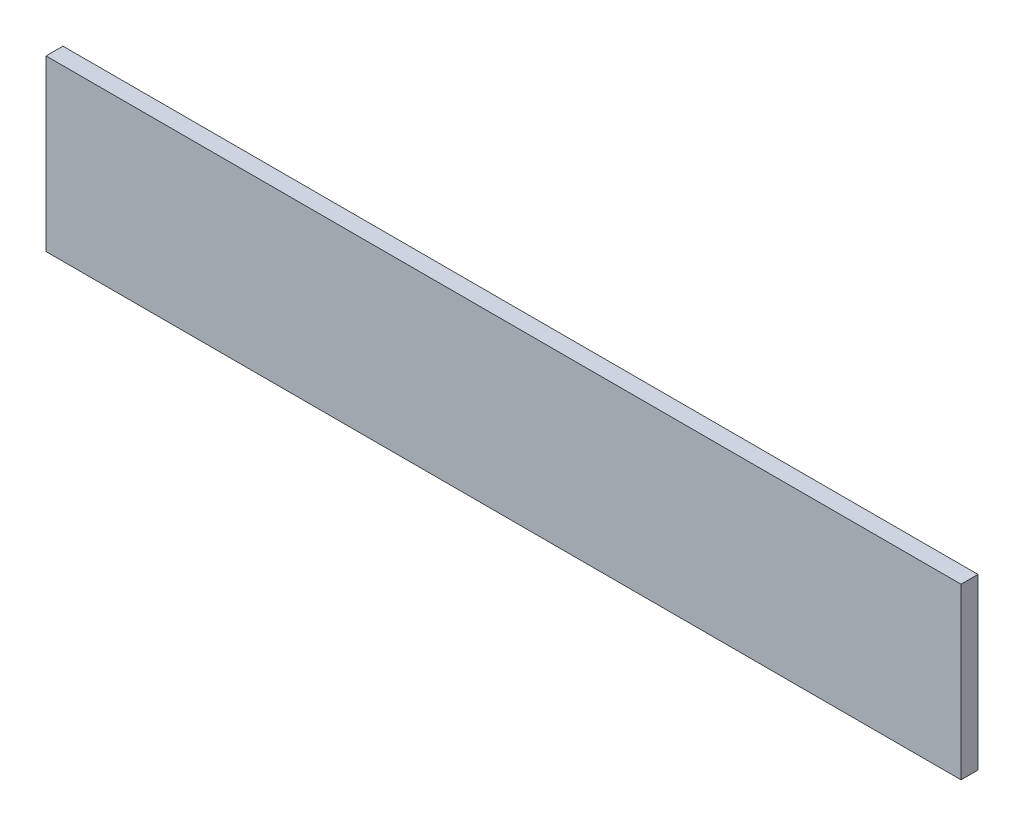
ISO-10303-21;
HEADER;
FILE_DESCRIPTION(('STEP AP214'),'2;1');
FILE_NAME('part.step','',(''),(''),'','','');
FILE_SCHEMA(('AUTOMOTIVE_DESIGN { 1 0 10303 214 1 1 1 1 }'));
ENDSEC;
DATA;
#1=APPLICATION_CONTEXT('core data for automotive mechanical design processes');
#2=APPLICATION_PROTOCOL_DEFINITION('international standard','automotive_design',2000,#1);
#3=PRODUCT_CONTEXT('',#1,'mechanical');
#4=PRODUCT('Part','Part','',(#3));
#5=PRODUCT_RELATED_PRODUCT_CATEGORY('part','',(#4));
#6=PRODUCT_DEFINITION_FORMATION('','',#4);
#7=PRODUCT_DEFINITION_CONTEXT('part definition',#1,'design');
#8=PRODUCT_DEFINITION('design','',#6,#7);
#9=PRODUCT_DEFINITION_SHAPE('','',#8);
#10=(LENGTH_UNIT() NAMED_UNIT(*) SI_UNIT(.MILLI.,.METRE.));
#11=(NAMED_UNIT(*) PLANE_ANGLE_UNIT() SI_UNIT($,.RADIAN.));
#12=(NAMED_UNIT(*) SI_UNIT($,.STERADIAN.) SOLID_ANGLE_UNIT());
#13=UNCERTAINTY_MEASURE_WITH_UNIT(LENGTH_MEASURE(1.E-05),#10,'distance_accuracy_value','');
#14=(GEOMETRIC_REPRESENTATION_CONTEXT(3) GLOBAL_UNCERTAINTY_ASSIGNED_CONTEXT((#13)) GLOBAL_UNIT_ASSIGNED_CONTEXT((#10,
#11,#12)) REPRESENTATION_CONTEXT('',''));
#15=CARTESIAN_POINT('',(0.,0.,0.));
#16=DIRECTION('',(0.,0.,1.));
#17=DIRECTION('',(1.,0.,0.));
#18=AXIS2_PLACEMENT_3D('',#15,#16,#17);
#19=CARTESIAN_POINT('',(0.,0.,10.));
#20=DIRECTION('',(1.,0.,0.));
#21=DIRECTION('',(0.,0.,-1.));
#22=AXIS2_PLACEMENT_3D('',#19,#20,#21);
#23=PLANE('',#22);
#24=DIRECTION('',(0.,-1.,0.));
#25=VECTOR('',#24,1.);
#26=CARTESIAN_POINT('',(0.,0.,0.));
#27=LINE('',#26,#25);
#28=CARTESIAN_POINT('',(0.,100.,0.));
#29=VERTEX_POINT('',#28);
#30=CARTESIAN_POINT('',(0.,0.,0.));
#31=VERTEX_POINT('',#30);
#32=EDGE_CURVE('E107',#29,#31,#27,.T.);
#33=ORIENTED_EDGE('',*,*,#32,.T.);
#34=DIRECTION('',(0.,0.,-1.));
#35=VECTOR('',#34,1.);
#36=CARTESIAN_POINT('',(0.,0.,10.));
#37=LINE('',#36,#35);
#38=CARTESIAN_POINT('',(0.,0.,10.));
#39=VERTEX_POINT('',#38);
#40=EDGE_CURVE('E11',#39,#31,#37,.T.);
#41=ORIENTED_EDGE('',*,*,#40,.F.);
#42=DIRECTION('',(0.,-1.,0.));
#43=VECTOR('',#42,1.);
#44=CARTESIAN_POINT('',(0.,0.,10.));
#45=LINE('',#44,#43);
#46=CARTESIAN_POINT('',(0.,100.,10.));
#47=VERTEX_POINT('',#46);
#48=EDGE_CURVE('E91',#47,#39,#45,.T.);
#49=ORIENTED_EDGE('',*,*,#48,.F.);
#50=DIRECTION('',(0.,0.,-1.));
#51=VECTOR('',#50,1.);
#52=CARTESIAN_POINT('',(0.,100.,10.));
#53=LINE('',#52,#51);
#54=EDGE_CURVE('E103',#47,#29,#53,.T.);
#55=ORIENTED_EDGE('',*,*,#54,.T.);
#56=EDGE_LOOP('',(#33,#41,#49,#55));
#57=FACE_BOUND('',#56,.T.);
#58=ADVANCED_FACE('F39',(#57),#23,.F.);
#59=CARTESIAN_POINT('',(0.,0.,10.));
#60=DIRECTION('',(0.,1.,0.));
#61=DIRECTION('',(0.,0.,1.));
#62=AXIS2_PLACEMENT_3D('',#59,#60,#61);
#63=PLANE('',#62);
#64=DIRECTION('',(1.,0.,0.));
#65=VECTOR('',#64,1.);
#66=CARTESIAN_POINT('',(0.,0.,0.));
#67=LINE('',#66,#65);
#68=CARTESIAN_POINT('',(540.,0.,0.));
#69=VERTEX_POINT('',#68);
#70=EDGE_CURVE('E96',#31,#69,#67,.T.);
#71=ORIENTED_EDGE('',*,*,#70,.T.);
#72=DIRECTION('',(0.,0.,-1.));
#73=VECTOR('',#72,1.);
#74=CARTESIAN_POINT('',(540.,0.,10.));
#75=LINE('',#74,#73);
#76=CARTESIAN_POINT('',(540.,0.,10.));
#77=VERTEX_POINT('',#76);
#78=EDGE_CURVE('E48',#77,#69,#75,.T.);
#79=ORIENTED_EDGE('',*,*,#78,.F.);
#80=DIRECTION('',(1.,0.,0.));
#81=VECTOR('',#80,1.);
#82=CARTESIAN_POINT('',(0.,0.,10.));
#83=LINE('',#82,#81);
#84=EDGE_CURVE('E86',#39,#77,#83,.T.);
#85=ORIENTED_EDGE('',*,*,#84,.F.);
#86=ORIENTED_EDGE('',*,*,#40,.T.);
#87=EDGE_LOOP('',(#71,#79,#85,#86));
#88=FACE_BOUND('',#87,.T.);
#89=ADVANCED_FACE('F95',(#88),#63,.F.);
#90=CARTESIAN_POINT('',(540.,0.,10.));
#91=DIRECTION('',(-1.,0.,0.));
#92=DIRECTION('',(0.,0.,1.));
#93=AXIS2_PLACEMENT_3D('',#90,#91,#92);
#94=PLANE('',#93);
#95=DIRECTION('',(0.,1.,0.));
#96=VECTOR('',#95,1.);
#97=CARTESIAN_POINT('',(540.,0.,0.));
#98=LINE('',#97,#96);
#99=CARTESIAN_POINT('',(540.,100.,0.));
#100=VERTEX_POINT('',#99);
#101=EDGE_CURVE('E73',#69,#100,#98,.T.);
#102=ORIENTED_EDGE('',*,*,#101,.T.);
#103=DIRECTION('',(0.,0.,-1.));
#104=VECTOR('',#103,1.);
#105=CARTESIAN_POINT('',(540.,100.,10.));
#106=LINE('',#105,#104);
#107=CARTESIAN_POINT('',(540.,100.,10.));
#108=VERTEX_POINT('',#107);
#109=EDGE_CURVE('E98',#108,#100,#106,.T.);
#110=ORIENTED_EDGE('',*,*,#109,.F.);
#111=DIRECTION('',(0.,1.,0.));
#112=VECTOR('',#111,1.);
#113=CARTESIAN_POINT('',(540.,0.,10.));
#114=LINE('',#113,#112);
#115=EDGE_CURVE('E89',#77,#108,#114,.T.);
#116=ORIENTED_EDGE('',*,*,#115,.F.);
#117=ORIENTED_EDGE('',*,*,#78,.T.);
#118=EDGE_LOOP('',(#102,#110,#116,#117));
#119=FACE_BOUND('',#118,.T.);
#120=ADVANCED_FACE('F99',(#119),#94,.F.);
#121=CARTESIAN_POINT('',(0.,100.,10.));
#122=DIRECTION('',(0.,-1.,0.));
#123=DIRECTION('',(0.,0.,-1.));
#124=AXIS2_PLACEMENT_3D('',#121,#122,#123);
#125=PLANE('',#124);
#126=DIRECTION('',(-1.,0.,0.));
#127=VECTOR('',#126,1.);
#128=CARTESIAN_POINT('',(0.,100.,0.));
#129=LINE('',#128,#127);
#130=EDGE_CURVE('E79',#100,#29,#129,.T.);
#131=ORIENTED_EDGE('',*,*,#130,.T.);
#132=ORIENTED_EDGE('',*,*,#54,.F.);
#133=DIRECTION('',(-1.,0.,0.));
#134=VECTOR('',#133,1.);
#135=CARTESIAN_POINT('',(0.,100.,10.));
#136=LINE('',#135,#134);
#137=EDGE_CURVE('E56',#108,#47,#136,.T.);
#138=ORIENTED_EDGE('',*,*,#137,.F.);
#139=ORIENTED_EDGE('',*,*,#109,.T.);
#140=EDGE_LOOP('',(#131,#132,#138,#139));
#141=FACE_BOUND('',#140,.T.);
#142=ADVANCED_FACE('F120',(#141),#125,.F.);
#143=CARTESIAN_POINT('',(0.,0.,10.));
#144=DIRECTION('',(0.,0.,-1.));
#145=DIRECTION('',(-1.,0.,0.));
#146=AXIS2_PLACEMENT_3D('',#143,#144,#145);
#147=PLANE('',#146);
#148=ORIENTED_EDGE('',*,*,#48,.T.);
#149=ORIENTED_EDGE('',*,*,#84,.T.);
#150=ORIENTED_EDGE('',*,*,#115,.T.);
#151=ORIENTED_EDGE('',*,*,#137,.T.);
#152=EDGE_LOOP('',(#148,#149,#150,#151));
#153=FACE_BOUND('',#152,.T.);
#154=ADVANCED_FACE('F87',(#153),#147,.F.);
#155=CARTESIAN_POINT('',(0.,0.,0.));
#156=DIRECTION('',(0.,0.,-1.));
#157=DIRECTION('',(-1.,0.,0.));
#158=AXIS2_PLACEMENT_3D('',#155,#156,#157);
#159=PLANE('',#158);
#160=ORIENTED_EDGE('',*,*,#32,.F.);
#161=ORIENTED_EDGE('',*,*,#130,.F.);
#162=ORIENTED_EDGE('',*,*,#101,.F.);
#163=ORIENTED_EDGE('',*,*,#70,.F.);
#164=EDGE_LOOP('',(#160,#161,#162,#163));
#165=FACE_BOUND('',#164,.T.);
#166=ADVANCED_FACE('F123',(#165),#159,.T.);
#167=CLOSED_SHELL('',(#58,#89,#120,#142,#154,#166));
#168=MANIFOLD_SOLID_BREP('B2',#167);
#169=ADVANCED_BREP_SHAPE_REPRESENTATION('',(#18,#168),#14);
#170=SHAPE_DEFINITION_REPRESENTATION(#9,#169);
ENDSEC;
END-ISO-10303-21;
